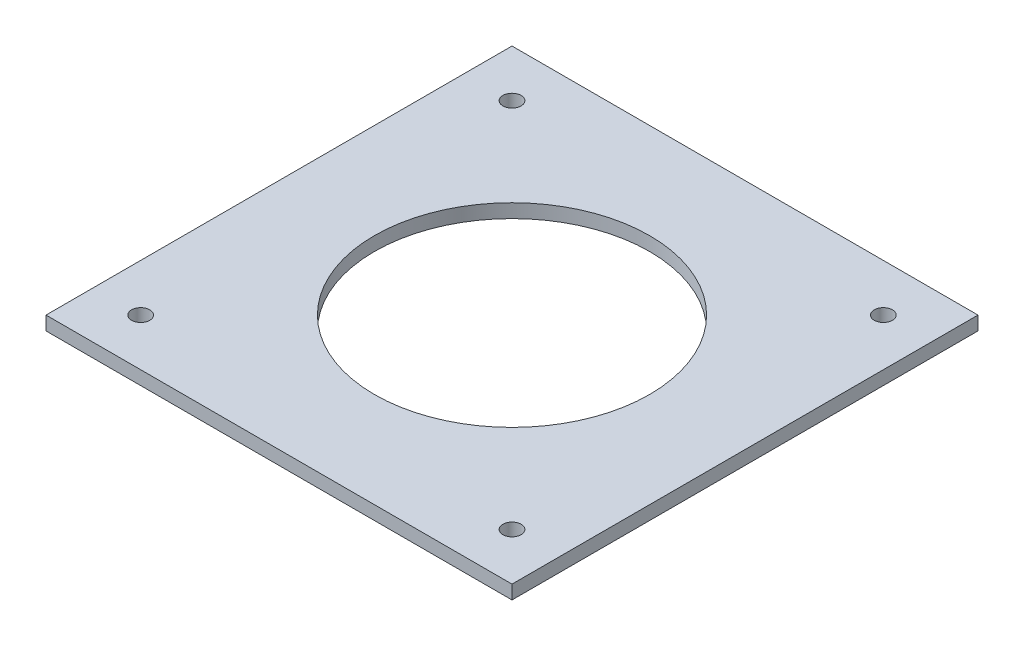
ISO-10303-21;
HEADER;
FILE_DESCRIPTION(('STEP AP214'),'2;1');
FILE_NAME('part.step','',(''),(''),'','','');
FILE_SCHEMA(('AUTOMOTIVE_DESIGN { 1 0 10303 214 1 1 1 1 }'));
ENDSEC;
DATA;
#1=APPLICATION_CONTEXT('core data for automotive mechanical design processes');
#2=APPLICATION_PROTOCOL_DEFINITION('international standard','automotive_design',2000,#1);
#3=PRODUCT_CONTEXT('',#1,'mechanical');
#4=PRODUCT('Part','Part','',(#3));
#5=PRODUCT_RELATED_PRODUCT_CATEGORY('part','',(#4));
#6=PRODUCT_DEFINITION_FORMATION('','',#4);
#7=PRODUCT_DEFINITION_CONTEXT('part definition',#1,'design');
#8=PRODUCT_DEFINITION('design','',#6,#7);
#9=PRODUCT_DEFINITION_SHAPE('','',#8);
#10=(LENGTH_UNIT() NAMED_UNIT(*) SI_UNIT(.MILLI.,.METRE.));
#11=(NAMED_UNIT(*) PLANE_ANGLE_UNIT() SI_UNIT($,.RADIAN.));
#12=(NAMED_UNIT(*) SI_UNIT($,.STERADIAN.) SOLID_ANGLE_UNIT());
#13=UNCERTAINTY_MEASURE_WITH_UNIT(LENGTH_MEASURE(1.E-05),#10,'distance_accuracy_value','');
#14=(GEOMETRIC_REPRESENTATION_CONTEXT(3) GLOBAL_UNCERTAINTY_ASSIGNED_CONTEXT((#13)) GLOBAL_UNIT_ASSIGNED_CONTEXT((#10,
#11,#12)) REPRESENTATION_CONTEXT('',''));
#15=CARTESIAN_POINT('',(0.,0.,0.));
#16=DIRECTION('',(0.,0.,1.));
#17=DIRECTION('',(1.,0.,0.));
#18=AXIS2_PLACEMENT_3D('',#15,#16,#17);
#19=CARTESIAN_POINT('',(0.,3.,0.));
#20=DIRECTION('',(0.,1.,0.));
#21=DIRECTION('',(0.,0.,1.));
#22=AXIS2_PLACEMENT_3D('',#19,#20,#21);
#23=PLANE('',#22);
#24=CARTESIAN_POINT('',(40.4799999999997,3.,40.4800000000003));
#25=DIRECTION('',(0.,1.,0.));
#26=DIRECTION('',(0.,0.,1.));
#27=AXIS2_PLACEMENT_3D('',#24,#25,#26);
#28=CIRCLE('',#27,1.98499999999999);
#29=CARTESIAN_POINT('',(40.4799999999997,3.,42.4650000000003));
#30=VERTEX_POINT('',#29);
#31=EDGE_CURVE('E135',#30,#30,#28,.T.);
#32=ORIENTED_EDGE('',*,*,#31,.F.);
#33=EDGE_LOOP('',(#32));
#34=FACE_BOUND('',#33,.T.);
#35=CARTESIAN_POINT('',(-40.48,3.,-40.48));
#36=DIRECTION('',(0.,1.,0.));
#37=DIRECTION('',(0.,0.,1.));
#38=AXIS2_PLACEMENT_3D('',#35,#36,#37);
#39=CIRCLE('',#38,1.98499999999999);
#40=CARTESIAN_POINT('',(-40.48,3.,-38.495));
#41=VERTEX_POINT('',#40);
#42=EDGE_CURVE('E123',#41,#41,#39,.T.);
#43=ORIENTED_EDGE('',*,*,#42,.F.);
#44=EDGE_LOOP('',(#43));
#45=FACE_BOUND('',#44,.T.);
#46=DIRECTION('',(0.,0.,1.));
#47=VECTOR('',#46,1.);
#48=CARTESIAN_POINT('',(-50.8,3.,-50.8));
#49=LINE('',#48,#47);
#50=CARTESIAN_POINT('',(-50.8,3.,-50.8));
#51=VERTEX_POINT('',#50);
#52=CARTESIAN_POINT('',(-50.8,3.,50.8));
#53=VERTEX_POINT('',#52);
#54=EDGE_CURVE('E93',#51,#53,#49,.T.);
#55=ORIENTED_EDGE('',*,*,#54,.T.);
#56=DIRECTION('',(1.,0.,0.));
#57=VECTOR('',#56,1.);
#58=CARTESIAN_POINT('',(-50.8,3.,50.8));
#59=LINE('',#58,#57);
#60=CARTESIAN_POINT('',(50.8,3.,50.8));
#61=VERTEX_POINT('',#60);
#62=EDGE_CURVE('E88',#53,#61,#59,.T.);
#63=ORIENTED_EDGE('',*,*,#62,.T.);
#64=DIRECTION('',(0.,0.,-1.));
#65=VECTOR('',#64,1.);
#66=CARTESIAN_POINT('',(50.8,3.,-50.8));
#67=LINE('',#66,#65);
#68=CARTESIAN_POINT('',(50.8,3.,-50.8));
#69=VERTEX_POINT('',#68);
#70=EDGE_CURVE('E91',#61,#69,#67,.T.);
#71=ORIENTED_EDGE('',*,*,#70,.T.);
#72=DIRECTION('',(-1.,0.,0.));
#73=VECTOR('',#72,1.);
#74=CARTESIAN_POINT('',(-50.8,3.,-50.8));
#75=LINE('',#74,#73);
#76=EDGE_CURVE('E58',#69,#51,#75,.T.);
#77=ORIENTED_EDGE('',*,*,#76,.T.);
#78=EDGE_LOOP('',(#55,#63,#71,#77));
#79=FACE_BOUND('',#78,.T.);
#80=CARTESIAN_POINT('',(0.,3.,0.));
#81=DIRECTION('',(0.,1.,0.));
#82=DIRECTION('',(0.,0.,1.));
#83=AXIS2_PLACEMENT_3D('',#80,#81,#82);
#84=CIRCLE('',#83,30.);
#85=CARTESIAN_POINT('',(0.,3.,30.));
#86=VERTEX_POINT('',#85);
#87=EDGE_CURVE('E108',#86,#86,#84,.T.);
#88=ORIENTED_EDGE('',*,*,#87,.F.);
#89=EDGE_LOOP('',(#88));
#90=FACE_BOUND('',#89,.T.);
#91=CARTESIAN_POINT('',(40.4800000000001,3.,-40.4799999999999));
#92=DIRECTION('',(0.,1.,0.));
#93=DIRECTION('',(0.,0.,1.));
#94=AXIS2_PLACEMENT_3D('',#91,#92,#93);
#95=CIRCLE('',#94,1.985);
#96=CARTESIAN_POINT('',(40.4800000000001,3.,-38.4949999999999));
#97=VERTEX_POINT('',#96);
#98=EDGE_CURVE('E129',#97,#97,#95,.T.);
#99=ORIENTED_EDGE('',*,*,#98,.F.);
#100=EDGE_LOOP('',(#99));
#101=FACE_BOUND('',#100,.T.);
#102=CARTESIAN_POINT('',(-40.4800000000004,3.,40.4799999999996));
#103=DIRECTION('',(0.,1.,0.));
#104=DIRECTION('',(0.,0.,1.));
#105=AXIS2_PLACEMENT_3D('',#102,#103,#104);
#106=CIRCLE('',#105,1.98499999999999);
#107=CARTESIAN_POINT('',(-40.4800000000004,3.,42.4649999999996));
#108=VERTEX_POINT('',#107);
#109=EDGE_CURVE('E141',#108,#108,#106,.T.);
#110=ORIENTED_EDGE('',*,*,#109,.F.);
#111=EDGE_LOOP('',(#110));
#112=FACE_BOUND('',#111,.T.);
#113=ADVANCED_FACE('F41',(#34,#45,#79,#90,#101,#112),#23,.T.);
#114=CARTESIAN_POINT('',(0.,0.,0.));
#115=DIRECTION('',(0.,1.,0.));
#116=DIRECTION('',(0.,0.,1.));
#117=AXIS2_PLACEMENT_3D('',#114,#115,#116);
#118=PLANE('',#117);
#119=DIRECTION('',(0.,0.,1.));
#120=VECTOR('',#119,1.);
#121=CARTESIAN_POINT('',(-50.8,0.,-50.8));
#122=LINE('',#121,#120);
#123=CARTESIAN_POINT('',(-50.8,0.,-50.8));
#124=VERTEX_POINT('',#123);
#125=CARTESIAN_POINT('',(-50.8,0.,50.8));
#126=VERTEX_POINT('',#125);
#127=EDGE_CURVE('E105',#124,#126,#122,.T.);
#128=ORIENTED_EDGE('',*,*,#127,.F.);
#129=DIRECTION('',(-1.,0.,0.));
#130=VECTOR('',#129,1.);
#131=CARTESIAN_POINT('',(-50.8,0.,-50.8));
#132=LINE('',#131,#130);
#133=CARTESIAN_POINT('',(50.8,0.,-50.8));
#134=VERTEX_POINT('',#133);
#135=EDGE_CURVE('E81',#134,#124,#132,.T.);
#136=ORIENTED_EDGE('',*,*,#135,.F.);
#137=DIRECTION('',(0.,0.,-1.));
#138=VECTOR('',#137,1.);
#139=CARTESIAN_POINT('',(50.8,0.,-50.8));
#140=LINE('',#139,#138);
#141=CARTESIAN_POINT('',(50.8,0.,50.8));
#142=VERTEX_POINT('',#141);
#143=EDGE_CURVE('E75',#142,#134,#140,.T.);
#144=ORIENTED_EDGE('',*,*,#143,.F.);
#145=DIRECTION('',(1.,0.,0.));
#146=VECTOR('',#145,1.);
#147=CARTESIAN_POINT('',(-50.8,0.,50.8));
#148=LINE('',#147,#146);
#149=EDGE_CURVE('E97',#126,#142,#148,.T.);
#150=ORIENTED_EDGE('',*,*,#149,.F.);
#151=EDGE_LOOP('',(#128,#136,#144,#150));
#152=FACE_BOUND('',#151,.T.);
#153=CARTESIAN_POINT('',(0.,0.,0.));
#154=DIRECTION('',(0.,1.,0.));
#155=DIRECTION('',(0.,0.,1.));
#156=AXIS2_PLACEMENT_3D('',#153,#154,#155);
#157=CIRCLE('',#156,30.);
#158=CARTESIAN_POINT('',(0.,0.,30.));
#159=VERTEX_POINT('',#158);
#160=EDGE_CURVE('E120',#159,#159,#157,.T.);
#161=ORIENTED_EDGE('',*,*,#160,.T.);
#162=EDGE_LOOP('',(#161));
#163=FACE_BOUND('',#162,.T.);
#164=CARTESIAN_POINT('',(-40.48,0.,-40.48));
#165=DIRECTION('',(0.,1.,0.));
#166=DIRECTION('',(0.,0.,1.));
#167=AXIS2_PLACEMENT_3D('',#164,#165,#166);
#168=CIRCLE('',#167,1.98499999999999);
#169=CARTESIAN_POINT('',(-40.48,0.,-38.495));
#170=VERTEX_POINT('',#169);
#171=EDGE_CURVE('E126',#170,#170,#168,.T.);
#172=ORIENTED_EDGE('',*,*,#171,.T.);
#173=EDGE_LOOP('',(#172));
#174=FACE_BOUND('',#173,.T.);
#175=CARTESIAN_POINT('',(40.4800000000001,0.,-40.4799999999999));
#176=DIRECTION('',(0.,1.,0.));
#177=DIRECTION('',(0.,0.,1.));
#178=AXIS2_PLACEMENT_3D('',#175,#176,#177);
#179=CIRCLE('',#178,1.985);
#180=CARTESIAN_POINT('',(40.4800000000001,0.,-38.4949999999999));
#181=VERTEX_POINT('',#180);
#182=EDGE_CURVE('E132',#181,#181,#179,.T.);
#183=ORIENTED_EDGE('',*,*,#182,.T.);
#184=EDGE_LOOP('',(#183));
#185=FACE_BOUND('',#184,.T.);
#186=CARTESIAN_POINT('',(40.4799999999997,0.,40.4800000000003));
#187=DIRECTION('',(0.,1.,0.));
#188=DIRECTION('',(0.,0.,1.));
#189=AXIS2_PLACEMENT_3D('',#186,#187,#188);
#190=CIRCLE('',#189,1.98499999999999);
#191=CARTESIAN_POINT('',(40.4799999999997,0.,42.4650000000003));
#192=VERTEX_POINT('',#191);
#193=EDGE_CURVE('E138',#192,#192,#190,.T.);
#194=ORIENTED_EDGE('',*,*,#193,.T.);
#195=EDGE_LOOP('',(#194));
#196=FACE_BOUND('',#195,.T.);
#197=CARTESIAN_POINT('',(-40.4800000000004,0.,40.4799999999996));
#198=DIRECTION('',(0.,1.,0.));
#199=DIRECTION('',(0.,0.,1.));
#200=AXIS2_PLACEMENT_3D('',#197,#198,#199);
#201=CIRCLE('',#200,1.98499999999999);
#202=CARTESIAN_POINT('',(-40.4800000000004,0.,42.4649999999996));
#203=VERTEX_POINT('',#202);
#204=EDGE_CURVE('E144',#203,#203,#201,.T.);
#205=ORIENTED_EDGE('',*,*,#204,.T.);
#206=EDGE_LOOP('',(#205));
#207=FACE_BOUND('',#206,.T.);
#208=ADVANCED_FACE('F116',(#152,#163,#174,#185,#196,#207),#118,.F.);
#209=CARTESIAN_POINT('',(-50.8,3.,-50.8));
#210=DIRECTION('',(1.,0.,0.));
#211=DIRECTION('',(0.,0.,-1.));
#212=AXIS2_PLACEMENT_3D('',#209,#210,#211);
#213=PLANE('',#212);
#214=ORIENTED_EDGE('',*,*,#127,.T.);
#215=DIRECTION('',(0.,-1.,0.));
#216=VECTOR('',#215,1.);
#217=CARTESIAN_POINT('',(-50.8,3.,50.8));
#218=LINE('',#217,#216);
#219=EDGE_CURVE('E11',#53,#126,#218,.T.);
#220=ORIENTED_EDGE('',*,*,#219,.F.);
#221=ORIENTED_EDGE('',*,*,#54,.F.);
#222=DIRECTION('',(0.,-1.,0.));
#223=VECTOR('',#222,1.);
#224=CARTESIAN_POINT('',(-50.8,3.,-50.8));
#225=LINE('',#224,#223);
#226=EDGE_CURVE('E101',#51,#124,#225,.T.);
#227=ORIENTED_EDGE('',*,*,#226,.T.);
#228=EDGE_LOOP('',(#214,#220,#221,#227));
#229=FACE_BOUND('',#228,.T.);
#230=ADVANCED_FACE('F43',(#229),#213,.F.);
#231=CARTESIAN_POINT('',(-50.8,3.,50.8));
#232=DIRECTION('',(0.,0.,-1.));
#233=DIRECTION('',(-1.,0.,0.));
#234=AXIS2_PLACEMENT_3D('',#231,#232,#233);
#235=PLANE('',#234);
#236=ORIENTED_EDGE('',*,*,#149,.T.);
#237=DIRECTION('',(0.,-1.,0.));
#238=VECTOR('',#237,1.);
#239=CARTESIAN_POINT('',(50.8,3.,50.8));
#240=LINE('',#239,#238);
#241=EDGE_CURVE('E50',#61,#142,#240,.T.);
#242=ORIENTED_EDGE('',*,*,#241,.F.);
#243=ORIENTED_EDGE('',*,*,#62,.F.);
#244=ORIENTED_EDGE('',*,*,#219,.T.);
#245=EDGE_LOOP('',(#236,#242,#243,#244));
#246=FACE_BOUND('',#245,.T.);
#247=ADVANCED_FACE('F96',(#246),#235,.F.);
#248=CARTESIAN_POINT('',(50.8,3.,-50.8));
#249=DIRECTION('',(-1.,0.,0.));
#250=DIRECTION('',(0.,0.,1.));
#251=AXIS2_PLACEMENT_3D('',#248,#249,#250);
#252=PLANE('',#251);
#253=ORIENTED_EDGE('',*,*,#143,.T.);
#254=DIRECTION('',(0.,-1.,0.));
#255=VECTOR('',#254,1.);
#256=CARTESIAN_POINT('',(50.8,3.,-50.8));
#257=LINE('',#256,#255);
#258=EDGE_CURVE('E98',#69,#134,#257,.T.);
#259=ORIENTED_EDGE('',*,*,#258,.F.);
#260=ORIENTED_EDGE('',*,*,#70,.F.);
#261=ORIENTED_EDGE('',*,*,#241,.T.);
#262=EDGE_LOOP('',(#253,#259,#260,#261));
#263=FACE_BOUND('',#262,.T.);
#264=ADVANCED_FACE('F99',(#263),#252,.F.);
#265=CARTESIAN_POINT('',(-50.8,3.,-50.8));
#266=DIRECTION('',(0.,0.,1.));
#267=DIRECTION('',(1.,0.,0.));
#268=AXIS2_PLACEMENT_3D('',#265,#266,#267);
#269=PLANE('',#268);
#270=ORIENTED_EDGE('',*,*,#135,.T.);
#271=ORIENTED_EDGE('',*,*,#226,.F.);
#272=ORIENTED_EDGE('',*,*,#76,.F.);
#273=ORIENTED_EDGE('',*,*,#258,.T.);
#274=EDGE_LOOP('',(#270,#271,#272,#273));
#275=FACE_BOUND('',#274,.T.);
#276=ADVANCED_FACE('F113',(#275),#269,.F.);
#277=CARTESIAN_POINT('',(0.,3.,0.));
#278=DIRECTION('',(0.,-1.,0.));
#279=DIRECTION('',(0.,0.,-1.));
#280=AXIS2_PLACEMENT_3D('',#277,#278,#279);
#281=CYLINDRICAL_SURFACE('',#280,30.);
#282=ORIENTED_EDGE('',*,*,#87,.T.);
#283=EDGE_LOOP('',(#282));
#284=FACE_BOUND('',#283,.T.);
#285=ORIENTED_EDGE('',*,*,#160,.F.);
#286=EDGE_LOOP('',(#285));
#287=FACE_BOUND('',#286,.T.);
#288=ADVANCED_FACE('F163',(#284,#287),#281,.F.);
#289=CARTESIAN_POINT('',(-40.48,3.,-40.48));
#290=DIRECTION('',(0.,-1.,0.));
#291=DIRECTION('',(0.,0.,-1.));
#292=AXIS2_PLACEMENT_3D('',#289,#290,#291);
#293=CYLINDRICAL_SURFACE('',#292,1.98499999999999);
#294=ORIENTED_EDGE('',*,*,#42,.T.);
#295=EDGE_LOOP('',(#294));
#296=FACE_BOUND('',#295,.T.);
#297=ORIENTED_EDGE('',*,*,#171,.F.);
#298=EDGE_LOOP('',(#297));
#299=FACE_BOUND('',#298,.T.);
#300=ADVANCED_FACE('F208',(#296,#299),#293,.F.);
#301=CARTESIAN_POINT('',(40.4800000000001,3.,-40.4799999999999));
#302=DIRECTION('',(0.,-1.,0.));
#303=DIRECTION('',(0.,0.,-1.));
#304=AXIS2_PLACEMENT_3D('',#301,#302,#303);
#305=CYLINDRICAL_SURFACE('',#304,1.985);
#306=ORIENTED_EDGE('',*,*,#98,.T.);
#307=EDGE_LOOP('',(#306));
#308=FACE_BOUND('',#307,.T.);
#309=ORIENTED_EDGE('',*,*,#182,.F.);
#310=EDGE_LOOP('',(#309));
#311=FACE_BOUND('',#310,.T.);
#312=ADVANCED_FACE('F216',(#308,#311),#305,.F.);
#313=CARTESIAN_POINT('',(40.4799999999997,3.,40.4800000000003));
#314=DIRECTION('',(0.,-1.,0.));
#315=DIRECTION('',(0.,0.,-1.));
#316=AXIS2_PLACEMENT_3D('',#313,#314,#315);
#317=CYLINDRICAL_SURFACE('',#316,1.98499999999999);
#318=ORIENTED_EDGE('',*,*,#31,.T.);
#319=EDGE_LOOP('',(#318));
#320=FACE_BOUND('',#319,.T.);
#321=ORIENTED_EDGE('',*,*,#193,.F.);
#322=EDGE_LOOP('',(#321));
#323=FACE_BOUND('',#322,.T.);
#324=ADVANCED_FACE('F224',(#320,#323),#317,.F.);
#325=CARTESIAN_POINT('',(-40.4800000000004,3.,40.4799999999996));
#326=DIRECTION('',(0.,-1.,0.));
#327=DIRECTION('',(0.,0.,-1.));
#328=AXIS2_PLACEMENT_3D('',#325,#326,#327);
#329=CYLINDRICAL_SURFACE('',#328,1.98499999999999);
#330=ORIENTED_EDGE('',*,*,#109,.T.);
#331=EDGE_LOOP('',(#330));
#332=FACE_BOUND('',#331,.T.);
#333=ORIENTED_EDGE('',*,*,#204,.F.);
#334=EDGE_LOOP('',(#333));
#335=FACE_BOUND('',#334,.T.);
#336=ADVANCED_FACE('F150',(#332,#335),#329,.F.);
#337=CLOSED_SHELL('',(#113,#208,#230,#247,#264,#276,#288,#300,#312,#324,#336));
#338=MANIFOLD_SOLID_BREP('B2',#337);
#339=ADVANCED_BREP_SHAPE_REPRESENTATION('',(#18,#338),#14);
#340=SHAPE_DEFINITION_REPRESENTATION(#9,#339);
ENDSEC;
END-ISO-10303-21;
